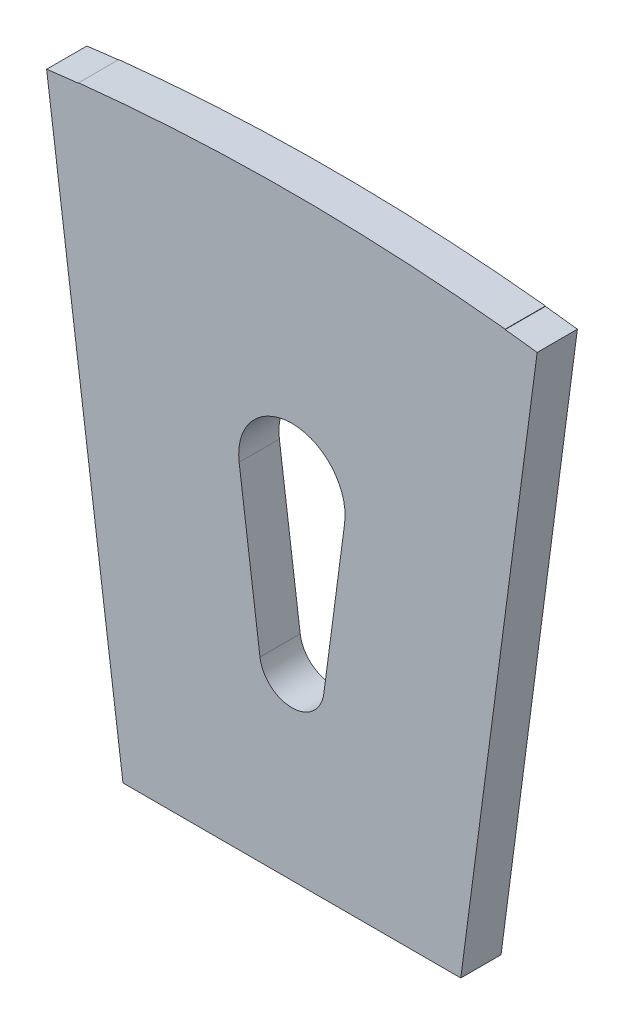
ISO-10303-21;
HEADER;
FILE_DESCRIPTION(('STEP AP214'),'2;1');
FILE_NAME('part.step','',(''),(''),'','','');
FILE_SCHEMA(('AUTOMOTIVE_DESIGN { 1 0 10303 214 1 1 1 1 }'));
ENDSEC;
DATA;
#1=APPLICATION_CONTEXT('core data for automotive mechanical design processes');
#2=APPLICATION_PROTOCOL_DEFINITION('international standard','automotive_design',2000,#1);
#3=PRODUCT_CONTEXT('',#1,'mechanical');
#4=PRODUCT('Part','Part','',(#3));
#5=PRODUCT_RELATED_PRODUCT_CATEGORY('part','',(#4));
#6=PRODUCT_DEFINITION_FORMATION('','',#4);
#7=PRODUCT_DEFINITION_CONTEXT('part definition',#1,'design');
#8=PRODUCT_DEFINITION('design','',#6,#7);
#9=PRODUCT_DEFINITION_SHAPE('','',#8);
#10=(LENGTH_UNIT() NAMED_UNIT(*) SI_UNIT(.MILLI.,.METRE.));
#11=(NAMED_UNIT(*) PLANE_ANGLE_UNIT() SI_UNIT($,.RADIAN.));
#12=(NAMED_UNIT(*) SI_UNIT($,.STERADIAN.) SOLID_ANGLE_UNIT());
#13=UNCERTAINTY_MEASURE_WITH_UNIT(LENGTH_MEASURE(1.E-05),#10,'distance_accuracy_value','');
#14=(GEOMETRIC_REPRESENTATION_CONTEXT(3) GLOBAL_UNCERTAINTY_ASSIGNED_CONTEXT((#13)) GLOBAL_UNIT_ASSIGNED_CONTEXT((#10,
#11,#12)) REPRESENTATION_CONTEXT('',''));
#15=CARTESIAN_POINT('',(0.,0.,0.));
#16=DIRECTION('',(0.,0.,1.));
#17=DIRECTION('',(1.,0.,0.));
#18=AXIS2_PLACEMENT_3D('',#15,#16,#17);
#19=CARTESIAN_POINT('',(-13.2563820997667,124.29508571792,2.5));
#20=DIRECTION('',(0.99144486137381,0.130526192220053,0.));
#21=DIRECTION('',(-0.130526192220053,0.99144486137381,0.));
#22=AXIS2_PLACEMENT_3D('',#19,#20,#21);
#23=PLANE('',#22);
#24=DIRECTION('',(0.,0.,1.));
#25=VECTOR('',#24,1.);
#26=CARTESIAN_POINT('',(-13.2530973512656,124.270135575983,-36.8949446981663));
#27=LINE('',#26,#25);
#28=CARTESIAN_POINT('',(-13.2530973512656,124.270135575983,0.));
#29=VERTEX_POINT('',#28);
#30=CARTESIAN_POINT('',(-13.2530973512656,124.270135575983,2.5));
#31=VERTEX_POINT('',#30);
#32=EDGE_CURVE('E149',#29,#31,#27,.T.);
#33=ORIENTED_EDGE('',*,*,#32,.T.);
#34=DIRECTION('',(0.130526192220053,-0.99144486137381,0.));
#35=VECTOR('',#34,1.);
#36=CARTESIAN_POINT('',(-13.2563820997667,124.29508571792,2.5));
#37=LINE('',#36,#35);
#38=CARTESIAN_POINT('',(-13.2563820997667,124.29508571792,2.5));
#39=VERTEX_POINT('',#38);
#40=EDGE_CURVE('E213',#39,#31,#37,.T.);
#41=ORIENTED_EDGE('',*,*,#40,.F.);
#42=DIRECTION('',(0.,0.,-1.));
#43=VECTOR('',#42,1.);
#44=CARTESIAN_POINT('',(-13.2563820997667,124.29508571792,2.5));
#45=LINE('',#44,#43);
#46=CARTESIAN_POINT('',(-13.2563820997667,124.29508571792,0.));
#47=VERTEX_POINT('',#46);
#48=EDGE_CURVE('E11',#39,#47,#45,.T.);
#49=ORIENTED_EDGE('',*,*,#48,.T.);
#50=DIRECTION('',(0.130526192220053,-0.99144486137381,0.));
#51=VECTOR('',#50,1.);
#52=CARTESIAN_POINT('',(-13.2563820997667,124.29508571792,0.));
#53=LINE('',#52,#51);
#54=EDGE_CURVE('E139',#47,#29,#53,.T.);
#55=ORIENTED_EDGE('',*,*,#54,.T.);
#56=EDGE_LOOP('',(#33,#41,#49,#55));
#57=FACE_BOUND('',#56,.T.);
#58=ADVANCED_FACE('F37',(#57),#23,.F.);
#59=CARTESIAN_POINT('',(13.2563820997667,124.29508571792,2.5));
#60=DIRECTION('',(0.99144486137381,-0.130526192220052,0.));
#61=DIRECTION('',(0.130526192220052,0.99144486137381,0.));
#62=AXIS2_PLACEMENT_3D('',#59,#60,#61);
#63=PLANE('',#62);
#64=DIRECTION('',(-0.130526192220052,-0.99144486137381,0.));
#65=VECTOR('',#64,1.);
#66=CARTESIAN_POINT('',(13.2563820997667,124.29508571792,2.5));
#67=LINE('',#66,#65);
#68=CARTESIAN_POINT('',(13.2563820997667,124.29508571792,2.5));
#69=VERTEX_POINT('',#68);
#70=CARTESIAN_POINT('',(13.2530973512656,124.270135575983,2.5));
#71=VERTEX_POINT('',#70);
#72=EDGE_CURVE('E209',#69,#71,#67,.T.);
#73=ORIENTED_EDGE('',*,*,#72,.T.);
#74=DIRECTION('',(0.,0.,1.));
#75=VECTOR('',#74,1.);
#76=CARTESIAN_POINT('',(13.2530973512656,124.270135575983,-36.8949446981663));
#77=LINE('',#76,#75);
#78=CARTESIAN_POINT('',(13.2530973512656,124.270135575983,0.));
#79=VERTEX_POINT('',#78);
#80=EDGE_CURVE('E173',#79,#71,#77,.T.);
#81=ORIENTED_EDGE('',*,*,#80,.F.);
#82=DIRECTION('',(-0.130526192220052,-0.99144486137381,0.));
#83=VECTOR('',#82,1.);
#84=CARTESIAN_POINT('',(13.2563820997667,124.29508571792,0.));
#85=LINE('',#84,#83);
#86=CARTESIAN_POINT('',(13.2563820997667,124.29508571792,0.));
#87=VERTEX_POINT('',#86);
#88=EDGE_CURVE('E140',#87,#79,#85,.T.);
#89=ORIENTED_EDGE('',*,*,#88,.F.);
#90=DIRECTION('',(0.,0.,-1.));
#91=VECTOR('',#90,1.);
#92=CARTESIAN_POINT('',(13.2563820997667,124.29508571792,2.5));
#93=LINE('',#92,#91);
#94=EDGE_CURVE('E41',#69,#87,#93,.T.);
#95=ORIENTED_EDGE('',*,*,#94,.F.);
#96=EDGE_LOOP('',(#73,#81,#89,#95));
#97=FACE_BOUND('',#96,.T.);
#98=ADVANCED_FACE('F231',(#97),#63,.T.);
#99=CARTESIAN_POINT('',(0.,0.,2.5));
#100=DIRECTION('',(0.,0.,-1.));
#101=DIRECTION('',(-1.,0.,0.));
#102=AXIS2_PLACEMENT_3D('',#99,#100,#101);
#103=PLANE('',#102);
#104=CARTESIAN_POINT('',(0.,0.,2.5));
#105=DIRECTION('',(0.,0.,-1.));
#106=DIRECTION('',(-1.,0.,0.));
#107=AXIS2_PLACEMENT_3D('',#104,#105,#106);
#108=CIRCLE('',#107,125.);
#109=EDGE_CURVE('E206',#39,#69,#108,.T.);
#110=ORIENTED_EDGE('',*,*,#109,.F.);
#111=ORIENTED_EDGE('',*,*,#40,.T.);
#112=CARTESIAN_POINT('',(0.,4.30820733123487,2.5));
#113=DIRECTION('',(0.,0.,1.));
#114=DIRECTION('',(1.,0.,0.));
#115=AXIS2_PLACEMENT_3D('',#112,#113,#114);
#116=CIRCLE('',#115,120.691792668765);
#117=CARTESIAN_POINT('',(-15.2392718225144,124.03403333348,2.5));
#118=VERTEX_POINT('',#117);
#119=EDGE_CURVE('E160',#118,#31,#116,.F.);
#120=ORIENTED_EDGE('',*,*,#119,.F.);
#121=DIRECTION('',(0.130526192220053,-0.99144486137381,0.));
#122=VECTOR('',#121,1.);
#123=CARTESIAN_POINT('',(1.07154600893271,0.141071708355799,2.5));
#124=LINE('',#123,#122);
#125=CARTESIAN_POINT('',(-10.4953013360143,88.,2.5));
#126=VERTEX_POINT('',#125);
#127=EDGE_CURVE('E154',#118,#126,#124,.T.);
#128=ORIENTED_EDGE('',*,*,#127,.T.);
#129=DIRECTION('',(1.,0.,0.));
#130=VECTOR('',#129,1.);
#131=CARTESIAN_POINT('',(-8.47804341485396,88.,2.5));
#132=LINE('',#131,#130);
#133=CARTESIAN_POINT('',(10.4953013360143,88.,2.5));
#134=VERTEX_POINT('',#133);
#135=EDGE_CURVE('E145',#126,#134,#132,.T.);
#136=ORIENTED_EDGE('',*,*,#135,.T.);
#137=DIRECTION('',(0.130526192220052,0.99144486137381,0.));
#138=VECTOR('',#137,1.);
#139=CARTESIAN_POINT('',(-1.07154600893267,0.141071708355793,2.5));
#140=LINE('',#139,#138);
#141=CARTESIAN_POINT('',(15.2392718225144,124.03403333348,2.5));
#142=VERTEX_POINT('',#141);
#143=EDGE_CURVE('E165',#134,#142,#140,.T.);
#144=ORIENTED_EDGE('',*,*,#143,.T.);
#145=CARTESIAN_POINT('',(0.,4.30820733123487,2.5));
#146=DIRECTION('',(0.,0.,1.));
#147=DIRECTION('',(1.,0.,0.));
#148=AXIS2_PLACEMENT_3D('',#145,#146,#147);
#149=CIRCLE('',#148,120.691792668765);
#150=EDGE_CURVE('E170',#71,#142,#149,.F.);
#151=ORIENTED_EDGE('',*,*,#150,.F.);
#152=ORIENTED_EDGE('',*,*,#72,.F.);
#153=EDGE_LOOP('',(#110,#111,#120,#128,#136,#144,#151,#152));
#154=FACE_BOUND('',#153,.T.);
#155=CARTESIAN_POINT('',(0.,109.29508571792,2.5));
#156=DIRECTION('',(0.,0.,1.));
#157=DIRECTION('',(1.,0.,0.));
#158=AXIS2_PLACEMENT_3D('',#155,#156,#157);
#159=CIRCLE('',#158,3.30526192220055);
#160=CARTESIAN_POINT('',(3.27698494826025,108.863662464925,2.5));
#161=VERTEX_POINT('',#160);
#162=CARTESIAN_POINT('',(-3.27698494826026,108.863662464925,2.5));
#163=VERTEX_POINT('',#162);
#164=EDGE_CURVE('E180',#161,#163,#159,.T.);
#165=ORIENTED_EDGE('',*,*,#164,.F.);
#166=DIRECTION('',(-0.130526192220055,-0.99144486137381,0.));
#167=VECTOR('',#166,1.);
#168=CARTESIAN_POINT('',(3.27698494826025,108.863662464925,2.5));
#169=LINE('',#168,#167);
#170=CARTESIAN_POINT('',(1.98288972274762,99.0340333334795,2.5));
#171=VERTEX_POINT('',#170);
#172=EDGE_CURVE('E187',#161,#171,#169,.T.);
#173=ORIENTED_EDGE('',*,*,#172,.T.);
#174=CARTESIAN_POINT('',(0.,99.2950857179196,2.5));
#175=DIRECTION('',(0.,0.,1.));
#176=DIRECTION('',(1.,0.,0.));
#177=AXIS2_PLACEMENT_3D('',#174,#175,#176);
#178=CIRCLE('',#177,2.);
#179=CARTESIAN_POINT('',(-1.98288972274762,99.0340333334795,2.5));
#180=VERTEX_POINT('',#179);
#181=EDGE_CURVE('E185',#180,#171,#178,.T.);
#182=ORIENTED_EDGE('',*,*,#181,.F.);
#183=DIRECTION('',(0.130526192220055,-0.99144486137381,0.));
#184=VECTOR('',#183,1.);
#185=CARTESIAN_POINT('',(-3.27698494826026,108.863662464925,2.5));
#186=LINE('',#185,#184);
#187=EDGE_CURVE('E182',#163,#180,#186,.T.);
#188=ORIENTED_EDGE('',*,*,#187,.F.);
#189=EDGE_LOOP('',(#165,#173,#182,#188));
#190=FACE_BOUND('',#189,.T.);
#191=ADVANCED_FACE('F240',(#154,#190),#103,.F.);
#192=CARTESIAN_POINT('',(0.,0.,0.));
#193=DIRECTION('',(0.,0.,-1.));
#194=DIRECTION('',(-1.,0.,0.));
#195=AXIS2_PLACEMENT_3D('',#192,#193,#194);
#196=PLANE('',#195);
#197=CARTESIAN_POINT('',(0.,0.,0.));
#198=DIRECTION('',(0.,0.,-1.));
#199=DIRECTION('',(-1.,0.,0.));
#200=AXIS2_PLACEMENT_3D('',#197,#198,#199);
#201=CIRCLE('',#200,125.);
#202=EDGE_CURVE('E205',#47,#87,#201,.T.);
#203=ORIENTED_EDGE('',*,*,#202,.T.);
#204=ORIENTED_EDGE('',*,*,#88,.T.);
#205=CARTESIAN_POINT('',(0.,4.30820733123487,0.));
#206=DIRECTION('',(0.,0.,-1.));
#207=DIRECTION('',(-1.,0.,0.));
#208=AXIS2_PLACEMENT_3D('',#205,#206,#207);
#209=CIRCLE('',#208,120.691792668765);
#210=CARTESIAN_POINT('',(15.2392718225144,124.03403333348,0.));
#211=VERTEX_POINT('',#210);
#212=EDGE_CURVE('E168',#79,#211,#209,.T.);
#213=ORIENTED_EDGE('',*,*,#212,.T.);
#214=DIRECTION('',(0.130526192220052,0.99144486137381,0.));
#215=VECTOR('',#214,1.);
#216=CARTESIAN_POINT('',(-1.07154600893267,0.141071708355793,0.));
#217=LINE('',#216,#215);
#218=CARTESIAN_POINT('',(10.4953013360143,88.,0.));
#219=VERTEX_POINT('',#218);
#220=EDGE_CURVE('E135',#219,#211,#217,.T.);
#221=ORIENTED_EDGE('',*,*,#220,.F.);
#222=DIRECTION('',(1.,0.,0.));
#223=VECTOR('',#222,1.);
#224=CARTESIAN_POINT('',(-8.47804341485396,88.,0.));
#225=LINE('',#224,#223);
#226=CARTESIAN_POINT('',(-10.4953013360143,88.,0.));
#227=VERTEX_POINT('',#226);
#228=EDGE_CURVE('E126',#227,#219,#225,.T.);
#229=ORIENTED_EDGE('',*,*,#228,.F.);
#230=DIRECTION('',(0.130526192220053,-0.99144486137381,0.));
#231=VECTOR('',#230,1.);
#232=CARTESIAN_POINT('',(1.07154600893271,0.141071708355799,0.));
#233=LINE('',#232,#231);
#234=CARTESIAN_POINT('',(-15.2392718225144,124.03403333348,0.));
#235=VERTEX_POINT('',#234);
#236=EDGE_CURVE('E132',#235,#227,#233,.T.);
#237=ORIENTED_EDGE('',*,*,#236,.F.);
#238=CARTESIAN_POINT('',(0.,4.30820733123487,0.));
#239=DIRECTION('',(0.,0.,-1.));
#240=DIRECTION('',(-1.,0.,0.));
#241=AXIS2_PLACEMENT_3D('',#238,#239,#240);
#242=CIRCLE('',#241,120.691792668765);
#243=EDGE_CURVE('E156',#235,#29,#242,.T.);
#244=ORIENTED_EDGE('',*,*,#243,.T.);
#245=ORIENTED_EDGE('',*,*,#54,.F.);
#246=EDGE_LOOP('',(#203,#204,#213,#221,#229,#237,#244,#245));
#247=FACE_BOUND('',#246,.T.);
#248=DIRECTION('',(-0.130526192220055,-0.99144486137381,0.));
#249=VECTOR('',#248,1.);
#250=CARTESIAN_POINT('',(3.27698494826025,108.863662464925,0.));
#251=LINE('',#250,#249);
#252=CARTESIAN_POINT('',(3.27698494826025,108.863662464925,0.));
#253=VERTEX_POINT('',#252);
#254=CARTESIAN_POINT('',(1.98288972274762,99.0340333334795,0.));
#255=VERTEX_POINT('',#254);
#256=EDGE_CURVE('E183',#253,#255,#251,.T.);
#257=ORIENTED_EDGE('',*,*,#256,.F.);
#258=CARTESIAN_POINT('',(0.,109.29508571792,0.));
#259=DIRECTION('',(0.,0.,1.));
#260=DIRECTION('',(1.,0.,0.));
#261=AXIS2_PLACEMENT_3D('',#258,#259,#260);
#262=CIRCLE('',#261,3.30526192220055);
#263=CARTESIAN_POINT('',(-3.27698494826026,108.863662464925,0.));
#264=VERTEX_POINT('',#263);
#265=EDGE_CURVE('E60',#253,#264,#262,.T.);
#266=ORIENTED_EDGE('',*,*,#265,.T.);
#267=DIRECTION('',(0.130526192220055,-0.99144486137381,0.));
#268=VECTOR('',#267,1.);
#269=CARTESIAN_POINT('',(-3.27698494826026,108.863662464925,0.));
#270=LINE('',#269,#268);
#271=CARTESIAN_POINT('',(-1.98288972274762,99.0340333334795,0.));
#272=VERTEX_POINT('',#271);
#273=EDGE_CURVE('E192',#264,#272,#270,.T.);
#274=ORIENTED_EDGE('',*,*,#273,.T.);
#275=CARTESIAN_POINT('',(0.,99.2950857179196,0.));
#276=DIRECTION('',(0.,0.,1.));
#277=DIRECTION('',(1.,0.,0.));
#278=AXIS2_PLACEMENT_3D('',#275,#276,#277);
#279=CIRCLE('',#278,2.);
#280=EDGE_CURVE('E195',#272,#255,#279,.T.);
#281=ORIENTED_EDGE('',*,*,#280,.T.);
#282=EDGE_LOOP('',(#257,#266,#274,#281));
#283=FACE_BOUND('',#282,.T.);
#284=ADVANCED_FACE('F129',(#247,#283),#196,.T.);
#285=CARTESIAN_POINT('',(0.,0.,2.5));
#286=DIRECTION('',(0.,0.,-1.));
#287=DIRECTION('',(-1.,0.,0.));
#288=AXIS2_PLACEMENT_3D('',#285,#286,#287);
#289=CYLINDRICAL_SURFACE('',#288,125.);
#290=ORIENTED_EDGE('',*,*,#202,.F.);
#291=ORIENTED_EDGE('',*,*,#48,.F.);
#292=ORIENTED_EDGE('',*,*,#109,.T.);
#293=ORIENTED_EDGE('',*,*,#94,.T.);
#294=EDGE_LOOP('',(#290,#291,#292,#293));
#295=FACE_BOUND('',#294,.T.);
#296=ADVANCED_FACE('F39',(#295),#289,.T.);
#297=CARTESIAN_POINT('',(-8.47804341485396,88.,2.5));
#298=DIRECTION('',(0.,1.,0.));
#299=DIRECTION('',(0.,0.,1.));
#300=AXIS2_PLACEMENT_3D('',#297,#298,#299);
#301=PLANE('',#300);
#302=ORIENTED_EDGE('',*,*,#228,.T.);
#303=DIRECTION('',(0.,0.,1.));
#304=VECTOR('',#303,1.);
#305=CARTESIAN_POINT('',(10.4953013360143,88.,-36.8949446981663));
#306=LINE('',#305,#304);
#307=EDGE_CURVE('E169',#219,#134,#306,.T.);
#308=ORIENTED_EDGE('',*,*,#307,.T.);
#309=ORIENTED_EDGE('',*,*,#135,.F.);
#310=DIRECTION('',(0.,0.,1.));
#311=VECTOR('',#310,1.);
#312=CARTESIAN_POINT('',(-10.4953013360143,88.,-36.8949446981663));
#313=LINE('',#312,#311);
#314=EDGE_CURVE('E143',#227,#126,#313,.T.);
#315=ORIENTED_EDGE('',*,*,#314,.F.);
#316=EDGE_LOOP('',(#302,#308,#309,#315));
#317=FACE_BOUND('',#316,.T.);
#318=ADVANCED_FACE('F144',(#317),#301,.F.);
#319=CARTESIAN_POINT('',(0.,109.29508571792,2.5));
#320=DIRECTION('',(0.,0.,-1.));
#321=DIRECTION('',(-1.,0.,0.));
#322=AXIS2_PLACEMENT_3D('',#319,#320,#321);
#323=CYLINDRICAL_SURFACE('',#322,3.30526192220055);
#324=ORIENTED_EDGE('',*,*,#265,.F.);
#325=DIRECTION('',(0.,0.,-1.));
#326=VECTOR('',#325,1.);
#327=CARTESIAN_POINT('',(3.27698494826025,108.863662464925,2.5));
#328=LINE('',#327,#326);
#329=EDGE_CURVE('E190',#161,#253,#328,.T.);
#330=ORIENTED_EDGE('',*,*,#329,.F.);
#331=ORIENTED_EDGE('',*,*,#164,.T.);
#332=DIRECTION('',(0.,0.,-1.));
#333=VECTOR('',#332,1.);
#334=CARTESIAN_POINT('',(-3.27698494826026,108.863662464925,2.5));
#335=LINE('',#334,#333);
#336=EDGE_CURVE('E203',#163,#264,#335,.T.);
#337=ORIENTED_EDGE('',*,*,#336,.T.);
#338=EDGE_LOOP('',(#324,#330,#331,#337));
#339=FACE_BOUND('',#338,.T.);
#340=ADVANCED_FACE('F260',(#339),#323,.F.);
#341=CARTESIAN_POINT('',(-3.27698494826026,108.863662464925,2.5));
#342=DIRECTION('',(0.99144486137381,0.130526192220055,0.));
#343=DIRECTION('',(-0.130526192220055,0.99144486137381,0.));
#344=AXIS2_PLACEMENT_3D('',#341,#342,#343);
#345=PLANE('',#344);
#346=ORIENTED_EDGE('',*,*,#273,.F.);
#347=ORIENTED_EDGE('',*,*,#336,.F.);
#348=ORIENTED_EDGE('',*,*,#187,.T.);
#349=DIRECTION('',(0.,0.,-1.));
#350=VECTOR('',#349,1.);
#351=CARTESIAN_POINT('',(-1.98288972274762,99.0340333334795,2.5));
#352=LINE('',#351,#350);
#353=EDGE_CURVE('E201',#180,#272,#352,.T.);
#354=ORIENTED_EDGE('',*,*,#353,.T.);
#355=EDGE_LOOP('',(#346,#347,#348,#354));
#356=FACE_BOUND('',#355,.T.);
#357=ADVANCED_FACE('F265',(#356),#345,.T.);
#358=CARTESIAN_POINT('',(0.,99.2950857179196,2.5));
#359=DIRECTION('',(0.,0.,-1.));
#360=DIRECTION('',(-1.,0.,0.));
#361=AXIS2_PLACEMENT_3D('',#358,#359,#360);
#362=CYLINDRICAL_SURFACE('',#361,2.);
#363=ORIENTED_EDGE('',*,*,#280,.F.);
#364=ORIENTED_EDGE('',*,*,#353,.F.);
#365=ORIENTED_EDGE('',*,*,#181,.T.);
#366=DIRECTION('',(0.,0.,-1.));
#367=VECTOR('',#366,1.);
#368=CARTESIAN_POINT('',(1.98288972274762,99.0340333334795,2.5));
#369=LINE('',#368,#367);
#370=EDGE_CURVE('E52',#171,#255,#369,.T.);
#371=ORIENTED_EDGE('',*,*,#370,.T.);
#372=EDGE_LOOP('',(#363,#364,#365,#371));
#373=FACE_BOUND('',#372,.T.);
#374=ADVANCED_FACE('F278',(#373),#362,.F.);
#375=CARTESIAN_POINT('',(3.27698494826025,108.863662464925,2.5));
#376=DIRECTION('',(0.99144486137381,-0.130526192220055,0.));
#377=DIRECTION('',(0.130526192220055,0.99144486137381,0.));
#378=AXIS2_PLACEMENT_3D('',#375,#376,#377);
#379=PLANE('',#378);
#380=ORIENTED_EDGE('',*,*,#256,.T.);
#381=ORIENTED_EDGE('',*,*,#370,.F.);
#382=ORIENTED_EDGE('',*,*,#172,.F.);
#383=ORIENTED_EDGE('',*,*,#329,.T.);
#384=EDGE_LOOP('',(#380,#381,#382,#383));
#385=FACE_BOUND('',#384,.T.);
#386=ADVANCED_FACE('F282',(#385),#379,.F.);
#387=CARTESIAN_POINT('',(0.,4.30820733123487,-36.8949446981663));
#388=DIRECTION('',(0.,0.,1.));
#389=DIRECTION('',(1.,0.,0.));
#390=AXIS2_PLACEMENT_3D('',#387,#388,#389);
#391=CYLINDRICAL_SURFACE('',#390,120.691792668765);
#392=ORIENTED_EDGE('',*,*,#212,.F.);
#393=ORIENTED_EDGE('',*,*,#80,.T.);
#394=ORIENTED_EDGE('',*,*,#150,.T.);
#395=DIRECTION('',(0.,0.,1.));
#396=VECTOR('',#395,1.);
#397=CARTESIAN_POINT('',(15.2392718225144,124.03403333348,-36.8949446981663));
#398=LINE('',#397,#396);
#399=EDGE_CURVE('E175',#211,#142,#398,.T.);
#400=ORIENTED_EDGE('',*,*,#399,.F.);
#401=EDGE_LOOP('',(#392,#393,#394,#400));
#402=FACE_BOUND('',#401,.T.);
#403=ADVANCED_FACE('F234',(#402),#391,.T.);
#404=CARTESIAN_POINT('',(-1.07154600893267,0.141071708355793,-36.8949446981663));
#405=DIRECTION('',(0.99144486137381,-0.130526192220052,0.));
#406=DIRECTION('',(0.130526192220052,0.99144486137381,0.));
#407=AXIS2_PLACEMENT_3D('',#404,#405,#406);
#408=PLANE('',#407);
#409=ORIENTED_EDGE('',*,*,#307,.F.);
#410=ORIENTED_EDGE('',*,*,#220,.T.);
#411=ORIENTED_EDGE('',*,*,#399,.T.);
#412=ORIENTED_EDGE('',*,*,#143,.F.);
#413=EDGE_LOOP('',(#409,#410,#411,#412));
#414=FACE_BOUND('',#413,.T.);
#415=ADVANCED_FACE('F238',(#414),#408,.T.);
#416=CARTESIAN_POINT('',(1.07154600893271,0.141071708355799,-36.8949446981663));
#417=DIRECTION('',(-0.99144486137381,-0.130526192220053,0.));
#418=DIRECTION('',(0.130526192220053,-0.99144486137381,0.));
#419=AXIS2_PLACEMENT_3D('',#416,#417,#418);
#420=PLANE('',#419);
#421=DIRECTION('',(0.,0.,1.));
#422=VECTOR('',#421,1.);
#423=CARTESIAN_POINT('',(-15.2392718225144,124.03403333348,-36.8949446981663));
#424=LINE('',#423,#422);
#425=EDGE_CURVE('E153',#235,#118,#424,.T.);
#426=ORIENTED_EDGE('',*,*,#425,.F.);
#427=ORIENTED_EDGE('',*,*,#236,.T.);
#428=ORIENTED_EDGE('',*,*,#314,.T.);
#429=ORIENTED_EDGE('',*,*,#127,.F.);
#430=EDGE_LOOP('',(#426,#427,#428,#429));
#431=FACE_BOUND('',#430,.T.);
#432=ADVANCED_FACE('F152',(#431),#420,.T.);
#433=CARTESIAN_POINT('',(0.,4.30820733123487,-36.8949446981663));
#434=DIRECTION('',(0.,0.,1.));
#435=DIRECTION('',(1.,0.,0.));
#436=AXIS2_PLACEMENT_3D('',#433,#434,#435);
#437=CYLINDRICAL_SURFACE('',#436,120.691792668765);
#438=ORIENTED_EDGE('',*,*,#243,.F.);
#439=ORIENTED_EDGE('',*,*,#425,.T.);
#440=ORIENTED_EDGE('',*,*,#119,.T.);
#441=ORIENTED_EDGE('',*,*,#32,.F.);
#442=EDGE_LOOP('',(#438,#439,#440,#441));
#443=FACE_BOUND('',#442,.T.);
#444=ADVANCED_FACE('F244',(#443),#437,.T.);
#445=CLOSED_SHELL('',(#58,#98,#191,#284,#296,#318,#340,#357,#374,#386,#403,#415,#432,#444));
#446=MANIFOLD_SOLID_BREP('B2',#445);
#447=ADVANCED_BREP_SHAPE_REPRESENTATION('',(#18,#446),#14);
#448=SHAPE_DEFINITION_REPRESENTATION(#9,#447);
ENDSEC;
END-ISO-10303-21;
